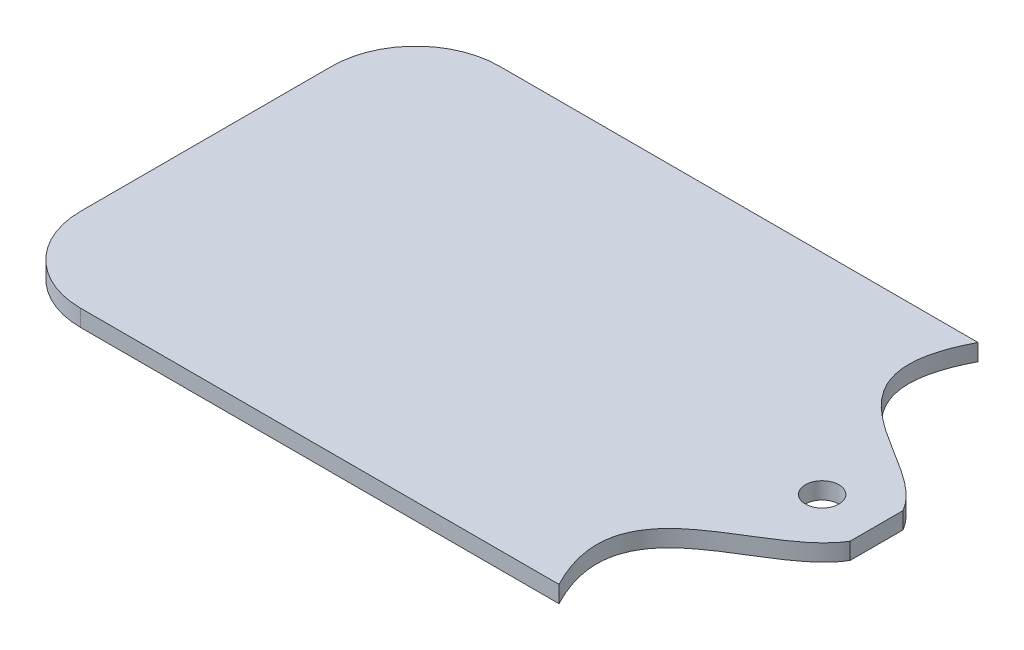
ISO-10303-21;
HEADER;
FILE_DESCRIPTION(('STEP AP214'),'2;1');
FILE_NAME('part.step','',(''),(''),'','','');
FILE_SCHEMA(('AUTOMOTIVE_DESIGN { 1 0 10303 214 1 1 1 1 }'));
ENDSEC;
DATA;
#1=APPLICATION_CONTEXT('core data for automotive mechanical design processes');
#2=APPLICATION_PROTOCOL_DEFINITION('international standard','automotive_design',2000,#1);
#3=PRODUCT_CONTEXT('',#1,'mechanical');
#4=PRODUCT('Part','Part','',(#3));
#5=PRODUCT_RELATED_PRODUCT_CATEGORY('part','',(#4));
#6=PRODUCT_DEFINITION_FORMATION('','',#4);
#7=PRODUCT_DEFINITION_CONTEXT('part definition',#1,'design');
#8=PRODUCT_DEFINITION('design','',#6,#7);
#9=PRODUCT_DEFINITION_SHAPE('','',#8);
#10=(LENGTH_UNIT() NAMED_UNIT(*) SI_UNIT(.MILLI.,.METRE.));
#11=(NAMED_UNIT(*) PLANE_ANGLE_UNIT() SI_UNIT($,.RADIAN.));
#12=(NAMED_UNIT(*) SI_UNIT($,.STERADIAN.) SOLID_ANGLE_UNIT());
#13=UNCERTAINTY_MEASURE_WITH_UNIT(LENGTH_MEASURE(1.E-05),#10,'distance_accuracy_value','');
#14=(GEOMETRIC_REPRESENTATION_CONTEXT(3) GLOBAL_UNCERTAINTY_ASSIGNED_CONTEXT((#13)) GLOBAL_UNIT_ASSIGNED_CONTEXT((#10,
#11,#12)) REPRESENTATION_CONTEXT('',''));
#15=CARTESIAN_POINT('',(0.,0.,0.));
#16=DIRECTION('',(0.,0.,1.));
#17=DIRECTION('',(1.,0.,0.));
#18=AXIS2_PLACEMENT_3D('',#15,#16,#17);
#19=CARTESIAN_POINT('',(293.29330993941,20.,-113.924384866748));
#20=DIRECTION('',(0.,-1.,0.));
#21=DIRECTION('',(0.,0.,-1.));
#22=AXIS2_PLACEMENT_3D('',#19,#20,#21);
#23=PLANE('',#22);
#24=CARTESIAN_POINT('',(400.,20.,-31.5066741919168));
#25=CARTESIAN_POINT('',(360.729994597882,20.,-99.4977583306495));
#26=CARTESIAN_POINT('',(197.722942542926,20.,-110.46504325004));
#27=CARTESIAN_POINT('',(270.987668092857,20.,-250.));
#28=B_SPLINE_CURVE_WITH_KNOTS('',3,(#24,#25,#26,#27),.UNSPECIFIED.,.F.,.F.,(4,4),(0.,
0.797108649727118),.UNSPECIFIED.);
#29=CARTESIAN_POINT('',(400.,20.,-31.5066741919168));
#30=VERTEX_POINT('',#29);
#31=CARTESIAN_POINT('',(270.987668092857,20.,-250.));
#32=VERTEX_POINT('',#31);
#33=EDGE_CURVE('E156',#30,#32,#28,.T.);
#34=ORIENTED_EDGE('',*,*,#33,.T.);
#35=DIRECTION('',(-1.,0.,0.));
#36=VECTOR('',#35,1.);
#37=CARTESIAN_POINT('',(-299.999999999999,20.,-250.));
#38=LINE('',#37,#36);
#39=CARTESIAN_POINT('',(-299.999999999999,20.,-250.));
#40=VERTEX_POINT('',#39);
#41=EDGE_CURVE('E162',#32,#40,#38,.T.);
#42=ORIENTED_EDGE('',*,*,#41,.T.);
#43=CARTESIAN_POINT('',(-300.,20.,-150.));
#44=DIRECTION('',(0.,1.,0.));
#45=DIRECTION('',(0.,0.,1.));
#46=AXIS2_PLACEMENT_3D('',#43,#44,#45);
#47=CIRCLE('',#46,100.);
#48=CARTESIAN_POINT('',(-400.,20.,-149.999999999999));
#49=VERTEX_POINT('',#48);
#50=EDGE_CURVE('E168',#40,#49,#47,.T.);
#51=ORIENTED_EDGE('',*,*,#50,.T.);
#52=DIRECTION('',(0.,0.,1.));
#53=VECTOR('',#52,1.);
#54=CARTESIAN_POINT('',(-400.,20.,-149.999999999999));
#55=LINE('',#54,#53);
#56=CARTESIAN_POINT('',(-400.,20.,149.999999999999));
#57=VERTEX_POINT('',#56);
#58=EDGE_CURVE('E170',#49,#57,#55,.T.);
#59=ORIENTED_EDGE('',*,*,#58,.T.);
#60=CARTESIAN_POINT('',(-300.,20.,150.));
#61=DIRECTION('',(0.,1.,0.));
#62=DIRECTION('',(0.,0.,1.));
#63=AXIS2_PLACEMENT_3D('',#60,#61,#62);
#64=CIRCLE('',#63,100.);
#65=CARTESIAN_POINT('',(-300.,20.,250.));
#66=VERTEX_POINT('',#65);
#67=EDGE_CURVE('E172',#57,#66,#64,.T.);
#68=ORIENTED_EDGE('',*,*,#67,.T.);
#69=DIRECTION('',(1.,0.,0.));
#70=VECTOR('',#69,1.);
#71=CARTESIAN_POINT('',(-299.999999999999,20.,250.));
#72=LINE('',#71,#70);
#73=CARTESIAN_POINT('',(270.987668092857,20.,250.));
#74=VERTEX_POINT('',#73);
#75=EDGE_CURVE('E174',#66,#74,#72,.T.);
#76=ORIENTED_EDGE('',*,*,#75,.T.);
#77=CARTESIAN_POINT('',(270.987668092857,20.,250.));
#78=CARTESIAN_POINT('',(197.722942542926,20.,110.46504325004));
#79=CARTESIAN_POINT('',(360.729994597882,20.,99.4977583306495));
#80=CARTESIAN_POINT('',(400.,20.,31.5066741919168));
#81=B_SPLINE_CURVE_WITH_KNOTS('',3,(#77,#78,#79,#80),.UNSPECIFIED.,.F.,.F.,(4,4),(0.,
0.797108649727118),.UNSPECIFIED.);
#82=CARTESIAN_POINT('',(400.,20.,31.5066741919168));
#83=VERTEX_POINT('',#82);
#84=EDGE_CURVE('E176',#74,#83,#81,.T.);
#85=ORIENTED_EDGE('',*,*,#84,.T.);
#86=DIRECTION('',(0.,0.,-1.));
#87=VECTOR('',#86,1.);
#88=CARTESIAN_POINT('',(400.,20.,-31.5066741919168));
#89=LINE('',#88,#87);
#90=EDGE_CURVE('E181',#83,#30,#89,.T.);
#91=ORIENTED_EDGE('',*,*,#90,.T.);
#92=EDGE_LOOP('',(#34,#42,#51,#59,#68,#76,#85,#91));
#93=FACE_BOUND('',#92,.T.);
#94=CARTESIAN_POINT('',(335.,20.,0.));
#95=DIRECTION('',(0.,1.,0.));
#96=DIRECTION('',(0.,0.,1.));
#97=AXIS2_PLACEMENT_3D('',#94,#95,#96);
#98=CIRCLE('',#97,20.);
#99=CARTESIAN_POINT('',(335.,20.,20.));
#100=VERTEX_POINT('',#99);
#101=EDGE_CURVE('E148',#100,#100,#98,.T.);
#102=ORIENTED_EDGE('',*,*,#101,.F.);
#103=EDGE_LOOP('',(#102));
#104=FACE_BOUND('',#103,.T.);
#105=ADVANCED_FACE('F34',(#93,#104),#23,.F.);
#106=CARTESIAN_POINT('',(293.29330993941,0.,-113.924384866748));
#107=DIRECTION('',(0.,-1.,0.));
#108=DIRECTION('',(0.,0.,-1.));
#109=AXIS2_PLACEMENT_3D('',#106,#107,#108);
#110=PLANE('',#109);
#111=DIRECTION('',(0.,0.,-1.));
#112=VECTOR('',#111,1.);
#113=CARTESIAN_POINT('',(-94.5061659535714,0.,-190.));
#114=LINE('',#113,#112);
#115=CARTESIAN_POINT('',(-94.5061659535714,0.,-190.));
#116=VERTEX_POINT('',#115);
#117=CARTESIAN_POINT('',(-94.5061659535713,0.,-250.));
#118=VERTEX_POINT('',#117);
#119=EDGE_CURVE('E50',#116,#118,#114,.T.);
#120=ORIENTED_EDGE('',*,*,#119,.F.);
#121=DIRECTION('',(-1.,0.,0.));
#122=VECTOR('',#121,1.);
#123=CARTESIAN_POINT('',(-34.5061659535714,0.,-190.));
#124=LINE('',#123,#122);
#125=CARTESIAN_POINT('',(-34.5061659535714,0.,-190.));
#126=VERTEX_POINT('',#125);
#127=EDGE_CURVE('E142',#126,#116,#124,.T.);
#128=ORIENTED_EDGE('',*,*,#127,.F.);
#129=DIRECTION('',(0.,0.,1.));
#130=VECTOR('',#129,1.);
#131=CARTESIAN_POINT('',(-34.5061659535714,0.,-190.));
#132=LINE('',#131,#130);
#133=CARTESIAN_POINT('',(-34.5061659535714,0.,-250.));
#134=VERTEX_POINT('',#133);
#135=EDGE_CURVE('E255',#134,#126,#132,.T.);
#136=ORIENTED_EDGE('',*,*,#135,.F.);
#137=DIRECTION('',(-1.,0.,0.));
#138=VECTOR('',#137,1.);
#139=CARTESIAN_POINT('',(-299.999999999999,0.,-250.));
#140=LINE('',#139,#138);
#141=CARTESIAN_POINT('',(270.987668092857,0.,-250.));
#142=VERTEX_POINT('',#141);
#143=EDGE_CURVE('E270',#142,#134,#140,.T.);
#144=ORIENTED_EDGE('',*,*,#143,.F.);
#145=CARTESIAN_POINT('',(400.,0.,-31.5066741919168));
#146=CARTESIAN_POINT('',(360.729994597882,0.,-99.4977583306495));
#147=CARTESIAN_POINT('',(197.722942542926,0.,-110.46504325004));
#148=CARTESIAN_POINT('',(270.987668092857,0.,-250.));
#149=B_SPLINE_CURVE_WITH_KNOTS('',3,(#145,#146,#147,#148),.UNSPECIFIED.,.F.,.F.,(4,4),(0.,
0.797108649727118),.UNSPECIFIED.);
#150=CARTESIAN_POINT('',(400.,0.,-31.5066741919168));
#151=VERTEX_POINT('',#150);
#152=EDGE_CURVE('E155',#151,#142,#149,.T.);
#153=ORIENTED_EDGE('',*,*,#152,.F.);
#154=DIRECTION('',(0.,0.,-1.));
#155=VECTOR('',#154,1.);
#156=CARTESIAN_POINT('',(400.,0.,-31.5066741919168));
#157=LINE('',#156,#155);
#158=CARTESIAN_POINT('',(400.,0.,31.5066741919168));
#159=VERTEX_POINT('',#158);
#160=EDGE_CURVE('E163',#159,#151,#157,.T.);
#161=ORIENTED_EDGE('',*,*,#160,.F.);
#162=CARTESIAN_POINT('',(270.987668092857,0.,250.));
#163=CARTESIAN_POINT('',(197.722942542926,0.,110.46504325004));
#164=CARTESIAN_POINT('',(360.729994597882,0.,99.4977583306495));
#165=CARTESIAN_POINT('',(400.,0.,31.5066741919168));
#166=B_SPLINE_CURVE_WITH_KNOTS('',3,(#162,#163,#164,#165),.UNSPECIFIED.,.F.,.F.,(4,4),(0.,
0.797108649727118),.UNSPECIFIED.);
#167=CARTESIAN_POINT('',(270.987668092857,0.,250.));
#168=VERTEX_POINT('',#167);
#169=EDGE_CURVE('E285',#168,#159,#166,.T.);
#170=ORIENTED_EDGE('',*,*,#169,.F.);
#171=DIRECTION('',(1.,0.,0.));
#172=VECTOR('',#171,1.);
#173=CARTESIAN_POINT('',(-299.999999999999,0.,250.));
#174=LINE('',#173,#172);
#175=CARTESIAN_POINT('',(-300.,0.,250.));
#176=VERTEX_POINT('',#175);
#177=EDGE_CURVE('E283',#176,#168,#174,.T.);
#178=ORIENTED_EDGE('',*,*,#177,.F.);
#179=CARTESIAN_POINT('',(-300.,0.,150.));
#180=DIRECTION('',(0.,1.,0.));
#181=DIRECTION('',(0.,0.,1.));
#182=AXIS2_PLACEMENT_3D('',#179,#180,#181);
#183=CIRCLE('',#182,100.);
#184=CARTESIAN_POINT('',(-400.,0.,149.999999999999));
#185=VERTEX_POINT('',#184);
#186=EDGE_CURVE('E281',#185,#176,#183,.T.);
#187=ORIENTED_EDGE('',*,*,#186,.F.);
#188=DIRECTION('',(0.,0.,1.));
#189=VECTOR('',#188,1.);
#190=CARTESIAN_POINT('',(-400.,0.,-149.999999999999));
#191=LINE('',#190,#189);
#192=CARTESIAN_POINT('',(-400.,0.,-149.999999999999));
#193=VERTEX_POINT('',#192);
#194=EDGE_CURVE('E275',#193,#185,#191,.T.);
#195=ORIENTED_EDGE('',*,*,#194,.F.);
#196=CARTESIAN_POINT('',(-300.,0.,-150.));
#197=DIRECTION('',(0.,1.,0.));
#198=DIRECTION('',(0.,0.,1.));
#199=AXIS2_PLACEMENT_3D('',#196,#197,#198);
#200=CIRCLE('',#199,100.);
#201=CARTESIAN_POINT('',(-299.999999999999,0.,-250.));
#202=VERTEX_POINT('',#201);
#203=EDGE_CURVE('E273',#202,#193,#200,.T.);
#204=ORIENTED_EDGE('',*,*,#203,.F.);
#205=EDGE_CURVE('E55',#118,#202,#140,.T.);
#206=ORIENTED_EDGE('',*,*,#205,.F.);
#207=EDGE_LOOP('',(#120,#128,#136,#144,#153,#161,#170,#178,#187,#195,#204,#206));
#208=FACE_BOUND('',#207,.T.);
#209=CARTESIAN_POINT('',(335.,0.,0.));
#210=DIRECTION('',(0.,1.,0.));
#211=DIRECTION('',(0.,0.,1.));
#212=AXIS2_PLACEMENT_3D('',#209,#210,#211);
#213=CIRCLE('',#212,20.);
#214=CARTESIAN_POINT('',(335.,0.,20.));
#215=VERTEX_POINT('',#214);
#216=EDGE_CURVE('E145',#215,#215,#213,.T.);
#217=ORIENTED_EDGE('',*,*,#216,.T.);
#218=EDGE_LOOP('',(#217));
#219=FACE_BOUND('',#218,.T.);
#220=ADVANCED_FACE('F214',(#208,#219),#110,.T.);
#221=DIRECTION('',(0.,-1.,0.));
#222=VECTOR('',#221,1.);
#223=SURFACE_OF_LINEAR_EXTRUSION('',#28,#222);
#224=ORIENTED_EDGE('',*,*,#152,.T.);
#225=DIRECTION('',(0.,-1.,0.));
#226=VECTOR('',#225,1.);
#227=CARTESIAN_POINT('',(270.987668092857,20.,-250.));
#228=LINE('',#227,#226);
#229=EDGE_CURVE('E11',#32,#142,#228,.T.);
#230=ORIENTED_EDGE('',*,*,#229,.F.);
#231=ORIENTED_EDGE('',*,*,#33,.F.);
#232=DIRECTION('',(0.,-1.,0.));
#233=VECTOR('',#232,1.);
#234=CARTESIAN_POINT('',(400.,20.,-31.5066741919168));
#235=LINE('',#234,#233);
#236=EDGE_CURVE('E293',#30,#151,#235,.T.);
#237=ORIENTED_EDGE('',*,*,#236,.T.);
#238=EDGE_LOOP('',(#224,#230,#231,#237));
#239=FACE_BOUND('',#238,.T.);
#240=ADVANCED_FACE('F36',(#239),#223,.F.);
#241=CARTESIAN_POINT('',(-299.999999999999,20.,-250.));
#242=DIRECTION('',(0.,0.,1.));
#243=DIRECTION('',(1.,0.,0.));
#244=AXIS2_PLACEMENT_3D('',#241,#242,#243);
#245=PLANE('',#244);
#246=CARTESIAN_POINT('',(-64.5061659535713,0.,-250.));
#247=DIRECTION('',(0.,0.,-1.));
#248=DIRECTION('',(-1.,0.,0.));
#249=AXIS2_PLACEMENT_3D('',#246,#247,#248);
#250=CIRCLE('',#249,5.);
#251=CARTESIAN_POINT('',(-69.5061659535713,0.,-250.));
#252=VERTEX_POINT('',#251);
#253=EDGE_CURVE('E253',#252,#252,#250,.T.);
#254=ORIENTED_EDGE('',*,*,#253,.F.);
#255=EDGE_LOOP('',(#254));
#256=FACE_BOUND('',#255,.T.);
#257=ORIENTED_EDGE('',*,*,#143,.T.);
#258=DIRECTION('',(0.,1.,0.));
#259=VECTOR('',#258,1.);
#260=CARTESIAN_POINT('',(-34.5061659535713,-20.,-250.));
#261=LINE('',#260,#259);
#262=CARTESIAN_POINT('',(-34.5061659535713,-20.,-250.));
#263=VERTEX_POINT('',#262);
#264=EDGE_CURVE('E129',#263,#134,#261,.T.);
#265=ORIENTED_EDGE('',*,*,#264,.F.);
#266=DIRECTION('',(1.,0.,0.));
#267=VECTOR('',#266,1.);
#268=CARTESIAN_POINT('',(-34.5061659535713,-20.,-250.));
#269=LINE('',#268,#267);
#270=CARTESIAN_POINT('',(-94.5061659535713,-20.,-250.));
#271=VERTEX_POINT('',#270);
#272=EDGE_CURVE('E122',#271,#263,#269,.T.);
#273=ORIENTED_EDGE('',*,*,#272,.F.);
#274=DIRECTION('',(0.,1.,0.));
#275=VECTOR('',#274,1.);
#276=CARTESIAN_POINT('',(-94.5061659535713,-20.,-250.));
#277=LINE('',#276,#275);
#278=EDGE_CURVE('E127',#271,#118,#277,.T.);
#279=ORIENTED_EDGE('',*,*,#278,.T.);
#280=ORIENTED_EDGE('',*,*,#205,.T.);
#281=DIRECTION('',(0.,-1.,0.));
#282=VECTOR('',#281,1.);
#283=CARTESIAN_POINT('',(-299.999999999999,20.,-250.));
#284=LINE('',#283,#282);
#285=EDGE_CURVE('E43',#40,#202,#284,.T.);
#286=ORIENTED_EDGE('',*,*,#285,.F.);
#287=ORIENTED_EDGE('',*,*,#41,.F.);
#288=ORIENTED_EDGE('',*,*,#229,.T.);
#289=EDGE_LOOP('',(#257,#265,#273,#279,#280,#286,#287,#288));
#290=FACE_BOUND('',#289,.T.);
#291=ADVANCED_FACE('F125',(#256,#290),#245,.F.);
#292=CARTESIAN_POINT('',(-300.,20.,-150.));
#293=DIRECTION('',(0.,-1.,0.));
#294=DIRECTION('',(0.,0.,-1.));
#295=AXIS2_PLACEMENT_3D('',#292,#293,#294);
#296=CYLINDRICAL_SURFACE('',#295,100.);
#297=ORIENTED_EDGE('',*,*,#203,.T.);
#298=DIRECTION('',(0.,-1.,0.));
#299=VECTOR('',#298,1.);
#300=CARTESIAN_POINT('',(-400.,20.,-149.999999999999));
#301=LINE('',#300,#299);
#302=EDGE_CURVE('E308',#49,#193,#301,.T.);
#303=ORIENTED_EDGE('',*,*,#302,.F.);
#304=ORIENTED_EDGE('',*,*,#50,.F.);
#305=ORIENTED_EDGE('',*,*,#285,.T.);
#306=EDGE_LOOP('',(#297,#303,#304,#305));
#307=FACE_BOUND('',#306,.T.);
#308=ADVANCED_FACE('F205',(#307),#296,.T.);
#309=CARTESIAN_POINT('',(-400.,20.,-149.999999999999));
#310=DIRECTION('',(1.,0.,0.));
#311=DIRECTION('',(0.,0.,-1.));
#312=AXIS2_PLACEMENT_3D('',#309,#310,#311);
#313=PLANE('',#312);
#314=ORIENTED_EDGE('',*,*,#194,.T.);
#315=DIRECTION('',(0.,-1.,0.));
#316=VECTOR('',#315,1.);
#317=CARTESIAN_POINT('',(-400.,20.,149.999999999999));
#318=LINE('',#317,#316);
#319=EDGE_CURVE('E305',#57,#185,#318,.T.);
#320=ORIENTED_EDGE('',*,*,#319,.F.);
#321=ORIENTED_EDGE('',*,*,#58,.F.);
#322=ORIENTED_EDGE('',*,*,#302,.T.);
#323=EDGE_LOOP('',(#314,#320,#321,#322));
#324=FACE_BOUND('',#323,.T.);
#325=ADVANCED_FACE('F201',(#324),#313,.F.);
#326=CARTESIAN_POINT('',(-300.,20.,150.));
#327=DIRECTION('',(0.,-1.,0.));
#328=DIRECTION('',(0.,0.,-1.));
#329=AXIS2_PLACEMENT_3D('',#326,#327,#328);
#330=CYLINDRICAL_SURFACE('',#329,100.);
#331=ORIENTED_EDGE('',*,*,#186,.T.);
#332=DIRECTION('',(0.,-1.,0.));
#333=VECTOR('',#332,1.);
#334=CARTESIAN_POINT('',(-300.,20.,250.));
#335=LINE('',#334,#333);
#336=EDGE_CURVE('E302',#66,#176,#335,.T.);
#337=ORIENTED_EDGE('',*,*,#336,.F.);
#338=ORIENTED_EDGE('',*,*,#67,.F.);
#339=ORIENTED_EDGE('',*,*,#319,.T.);
#340=EDGE_LOOP('',(#331,#337,#338,#339));
#341=FACE_BOUND('',#340,.T.);
#342=ADVANCED_FACE('F197',(#341),#330,.T.);
#343=CARTESIAN_POINT('',(-299.999999999999,20.,250.));
#344=DIRECTION('',(0.,0.,-1.));
#345=DIRECTION('',(-1.,0.,0.));
#346=AXIS2_PLACEMENT_3D('',#343,#344,#345);
#347=PLANE('',#346);
#348=ORIENTED_EDGE('',*,*,#177,.T.);
#349=DIRECTION('',(0.,-1.,0.));
#350=VECTOR('',#349,1.);
#351=CARTESIAN_POINT('',(270.987668092857,20.,250.));
#352=LINE('',#351,#350);
#353=EDGE_CURVE('E299',#74,#168,#352,.T.);
#354=ORIENTED_EDGE('',*,*,#353,.F.);
#355=ORIENTED_EDGE('',*,*,#75,.F.);
#356=ORIENTED_EDGE('',*,*,#336,.T.);
#357=EDGE_LOOP('',(#348,#354,#355,#356));
#358=FACE_BOUND('',#357,.T.);
#359=ADVANCED_FACE('F192',(#358),#347,.F.);
#360=DIRECTION('',(0.,-1.,0.));
#361=VECTOR('',#360,1.);
#362=SURFACE_OF_LINEAR_EXTRUSION('',#81,#361);
#363=ORIENTED_EDGE('',*,*,#169,.T.);
#364=DIRECTION('',(0.,-1.,0.));
#365=VECTOR('',#364,1.);
#366=CARTESIAN_POINT('',(400.,20.,31.5066741919168));
#367=LINE('',#366,#365);
#368=EDGE_CURVE('E296',#83,#159,#367,.T.);
#369=ORIENTED_EDGE('',*,*,#368,.F.);
#370=ORIENTED_EDGE('',*,*,#84,.F.);
#371=ORIENTED_EDGE('',*,*,#353,.T.);
#372=EDGE_LOOP('',(#363,#369,#370,#371));
#373=FACE_BOUND('',#372,.T.);
#374=ADVANCED_FACE('F187',(#373),#362,.F.);
#375=CARTESIAN_POINT('',(400.,20.,-31.5066741919168));
#376=DIRECTION('',(-1.,0.,0.));
#377=DIRECTION('',(0.,0.,1.));
#378=AXIS2_PLACEMENT_3D('',#375,#376,#377);
#379=PLANE('',#378);
#380=ORIENTED_EDGE('',*,*,#160,.T.);
#381=ORIENTED_EDGE('',*,*,#236,.F.);
#382=ORIENTED_EDGE('',*,*,#90,.F.);
#383=ORIENTED_EDGE('',*,*,#368,.T.);
#384=EDGE_LOOP('',(#380,#381,#382,#383));
#385=FACE_BOUND('',#384,.T.);
#386=ADVANCED_FACE('F191',(#385),#379,.F.);
#387=CARTESIAN_POINT('',(335.,20.,0.));
#388=DIRECTION('',(0.,-1.,0.));
#389=DIRECTION('',(0.,0.,-1.));
#390=AXIS2_PLACEMENT_3D('',#387,#388,#389);
#391=CYLINDRICAL_SURFACE('',#390,20.);
#392=ORIENTED_EDGE('',*,*,#101,.T.);
#393=EDGE_LOOP('',(#392));
#394=FACE_BOUND('',#393,.T.);
#395=ORIENTED_EDGE('',*,*,#216,.F.);
#396=EDGE_LOOP('',(#395));
#397=FACE_BOUND('',#396,.T.);
#398=ADVANCED_FACE('F225',(#394,#397),#391,.F.);
#399=CARTESIAN_POINT('',(-94.5061659535714,-20.,-190.));
#400=DIRECTION('',(1.,0.,0.));
#401=DIRECTION('',(0.,0.,-1.));
#402=AXIS2_PLACEMENT_3D('',#399,#400,#401);
#403=PLANE('',#402);
#404=ORIENTED_EDGE('',*,*,#119,.T.);
#405=ORIENTED_EDGE('',*,*,#278,.F.);
#406=DIRECTION('',(0.,0.,-1.));
#407=VECTOR('',#406,1.);
#408=CARTESIAN_POINT('',(-94.5061659535714,-20.,-190.));
#409=LINE('',#408,#407);
#410=CARTESIAN_POINT('',(-94.5061659535714,-20.,-190.));
#411=VERTEX_POINT('',#410);
#412=EDGE_CURVE('E133',#411,#271,#409,.T.);
#413=ORIENTED_EDGE('',*,*,#412,.F.);
#414=DIRECTION('',(0.,1.,0.));
#415=VECTOR('',#414,1.);
#416=CARTESIAN_POINT('',(-94.5061659535714,-20.,-190.));
#417=LINE('',#416,#415);
#418=EDGE_CURVE('E261',#411,#116,#417,.T.);
#419=ORIENTED_EDGE('',*,*,#418,.T.);
#420=EDGE_LOOP('',(#404,#405,#413,#419));
#421=FACE_BOUND('',#420,.T.);
#422=ADVANCED_FACE('F144',(#421),#403,.F.);
#423=CARTESIAN_POINT('',(-34.5061659535714,-20.,-190.));
#424=DIRECTION('',(-1.,0.,0.));
#425=DIRECTION('',(0.,0.,1.));
#426=AXIS2_PLACEMENT_3D('',#423,#424,#425);
#427=PLANE('',#426);
#428=ORIENTED_EDGE('',*,*,#135,.T.);
#429=DIRECTION('',(0.,1.,0.));
#430=VECTOR('',#429,1.);
#431=CARTESIAN_POINT('',(-34.5061659535714,-20.,-190.));
#432=LINE('',#431,#430);
#433=CARTESIAN_POINT('',(-34.5061659535714,-20.,-190.));
#434=VERTEX_POINT('',#433);
#435=EDGE_CURVE('E150',#434,#126,#432,.T.);
#436=ORIENTED_EDGE('',*,*,#435,.F.);
#437=DIRECTION('',(0.,0.,1.));
#438=VECTOR('',#437,1.);
#439=CARTESIAN_POINT('',(-34.5061659535714,-20.,-190.));
#440=LINE('',#439,#438);
#441=EDGE_CURVE('E132',#263,#434,#440,.T.);
#442=ORIENTED_EDGE('',*,*,#441,.F.);
#443=ORIENTED_EDGE('',*,*,#264,.T.);
#444=EDGE_LOOP('',(#428,#436,#442,#443));
#445=FACE_BOUND('',#444,.T.);
#446=ADVANCED_FACE('F231',(#445),#427,.F.);
#447=CARTESIAN_POINT('',(-34.5061659535714,-20.,-190.));
#448=DIRECTION('',(0.,0.,-1.));
#449=DIRECTION('',(-1.,0.,0.));
#450=AXIS2_PLACEMENT_3D('',#447,#448,#449);
#451=PLANE('',#450);
#452=ORIENTED_EDGE('',*,*,#127,.T.);
#453=ORIENTED_EDGE('',*,*,#418,.F.);
#454=DIRECTION('',(-1.,0.,0.));
#455=VECTOR('',#454,1.);
#456=CARTESIAN_POINT('',(-34.5061659535714,-20.,-190.));
#457=LINE('',#456,#455);
#458=EDGE_CURVE('E138',#434,#411,#457,.T.);
#459=ORIENTED_EDGE('',*,*,#458,.F.);
#460=ORIENTED_EDGE('',*,*,#435,.T.);
#461=EDGE_LOOP('',(#452,#453,#459,#460));
#462=FACE_BOUND('',#461,.T.);
#463=ADVANCED_FACE('F234',(#462),#451,.F.);
#464=CARTESIAN_POINT('',(0.,-20.,0.));
#465=DIRECTION('',(0.,1.,0.));
#466=DIRECTION('',(0.,0.,1.));
#467=AXIS2_PLACEMENT_3D('',#464,#465,#466);
#468=PLANE('',#467);
#469=ORIENTED_EDGE('',*,*,#412,.T.);
#470=ORIENTED_EDGE('',*,*,#272,.T.);
#471=ORIENTED_EDGE('',*,*,#441,.T.);
#472=ORIENTED_EDGE('',*,*,#458,.T.);
#473=EDGE_LOOP('',(#469,#470,#471,#472));
#474=FACE_BOUND('',#473,.T.);
#475=ADVANCED_FACE('F136',(#474),#468,.F.);
#476=CARTESIAN_POINT('',(-64.5061659535713,0.,-230.));
#477=DIRECTION('',(0.,0.,-1.));
#478=DIRECTION('',(-1.,0.,0.));
#479=AXIS2_PLACEMENT_3D('',#476,#477,#478);
#480=CYLINDRICAL_SURFACE('',#479,5.);
#481=CARTESIAN_POINT('',(-64.5061659535713,0.,-230.));
#482=DIRECTION('',(0.,0.,-1.));
#483=DIRECTION('',(-1.,0.,0.));
#484=AXIS2_PLACEMENT_3D('',#481,#482,#483);
#485=CIRCLE('',#484,5.);
#486=CARTESIAN_POINT('',(-69.5061659535713,0.,-230.));
#487=VERTEX_POINT('',#486);
#488=EDGE_CURVE('E252',#487,#487,#485,.T.);
#489=ORIENTED_EDGE('',*,*,#488,.F.);
#490=EDGE_LOOP('',(#489));
#491=FACE_BOUND('',#490,.T.);
#492=ORIENTED_EDGE('',*,*,#253,.T.);
#493=EDGE_LOOP('',(#492));
#494=FACE_BOUND('',#493,.T.);
#495=ADVANCED_FACE('F241',(#491,#494),#480,.F.);
#496=CARTESIAN_POINT('',(-64.5061659535713,0.,-230.));
#497=DIRECTION('',(0.,0.,-1.));
#498=DIRECTION('',(-1.,0.,0.));
#499=AXIS2_PLACEMENT_3D('',#496,#497,#498);
#500=PLANE('',#499);
#501=ORIENTED_EDGE('',*,*,#488,.T.);
#502=EDGE_LOOP('',(#501));
#503=FACE_BOUND('',#502,.T.);
#504=ADVANCED_FACE('F244',(#503),#500,.T.);
#505=CLOSED_SHELL('',(#105,#220,#240,#291,#308,#325,#342,#359,#374,#386,#398,#422,#446,#463,
#475,#495,#504));
#506=MANIFOLD_SOLID_BREP('B2',#505);
#507=ADVANCED_BREP_SHAPE_REPRESENTATION('',(#18,#506),#14);
#508=SHAPE_DEFINITION_REPRESENTATION(#9,#507);
ENDSEC;
END-ISO-10303-21;
